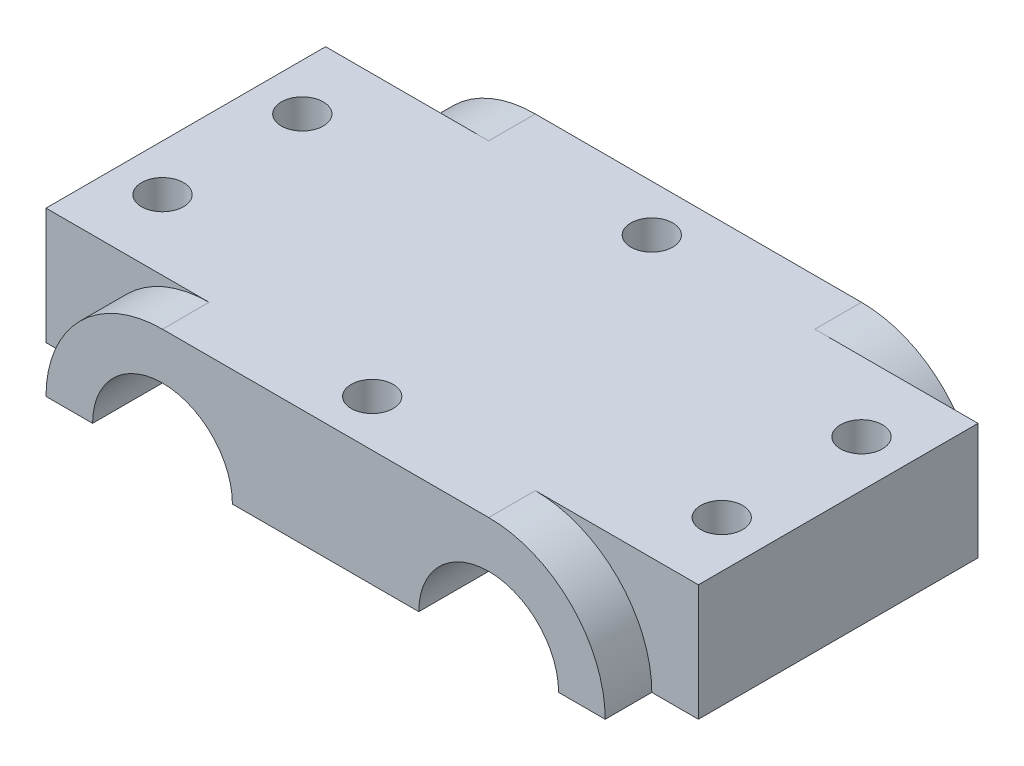
ISO-10303-21;
HEADER;
FILE_DESCRIPTION(('STEP AP214'),'2;1');
FILE_NAME('part.step','',(''),(''),'','','');
FILE_SCHEMA(('AUTOMOTIVE_DESIGN { 1 0 10303 214 1 1 1 1 }'));
ENDSEC;
DATA;
#1=APPLICATION_CONTEXT('core data for automotive mechanical design processes');
#2=APPLICATION_PROTOCOL_DEFINITION('international standard','automotive_design',2000,#1);
#3=PRODUCT_CONTEXT('',#1,'mechanical');
#4=PRODUCT('Part','Part','',(#3));
#5=PRODUCT_RELATED_PRODUCT_CATEGORY('part','',(#4));
#6=PRODUCT_DEFINITION_FORMATION('','',#4);
#7=PRODUCT_DEFINITION_CONTEXT('part definition',#1,'design');
#8=PRODUCT_DEFINITION('design','',#6,#7);
#9=PRODUCT_DEFINITION_SHAPE('','',#8);
#10=(LENGTH_UNIT() NAMED_UNIT(*) SI_UNIT(.MILLI.,.METRE.));
#11=(NAMED_UNIT(*) PLANE_ANGLE_UNIT() SI_UNIT($,.RADIAN.));
#12=(NAMED_UNIT(*) SI_UNIT($,.STERADIAN.) SOLID_ANGLE_UNIT());
#13=UNCERTAINTY_MEASURE_WITH_UNIT(LENGTH_MEASURE(1.E-05),#10,'distance_accuracy_value','');
#14=(GEOMETRIC_REPRESENTATION_CONTEXT(3) GLOBAL_UNCERTAINTY_ASSIGNED_CONTEXT((#13)) GLOBAL_UNIT_ASSIGNED_CONTEXT((#10,
#11,#12)) REPRESENTATION_CONTEXT('',''));
#15=CARTESIAN_POINT('',(0.,0.,0.));
#16=DIRECTION('',(0.,0.,1.));
#17=DIRECTION('',(1.,0.,0.));
#18=AXIS2_PLACEMENT_3D('',#15,#16,#17);
#19=CARTESIAN_POINT('',(0.,0.,0.));
#20=DIRECTION('',(0.,1.,0.));
#21=DIRECTION('',(0.,0.,1.));
#22=AXIS2_PLACEMENT_3D('',#19,#20,#21);
#23=PLANE('',#22);
#24=CARTESIAN_POINT('',(-30.,0.,7.49999999999999));
#25=DIRECTION('',(0.,1.,0.));
#26=DIRECTION('',(0.,0.,1.));
#27=AXIS2_PLACEMENT_3D('',#24,#25,#26);
#28=CIRCLE('',#27,2.25);
#29=CARTESIAN_POINT('',(-30.,0.,9.74999999999999));
#30=VERTEX_POINT('',#29);
#31=EDGE_CURVE('E584',#30,#30,#28,.T.);
#32=ORIENTED_EDGE('',*,*,#31,.T.);
#33=EDGE_LOOP('',(#32));
#34=FACE_BOUND('',#33,.T.);
#35=CARTESIAN_POINT('',(-30.,0.,-7.49999999999999));
#36=DIRECTION('',(0.,1.,0.));
#37=DIRECTION('',(0.,0.,-1.));
#38=AXIS2_PLACEMENT_3D('',#35,#36,#37);
#39=CIRCLE('',#38,2.25);
#40=CARTESIAN_POINT('',(-30.,0.,-9.74999999999999));
#41=VERTEX_POINT('',#40);
#42=EDGE_CURVE('E411',#41,#41,#39,.T.);
#43=ORIENTED_EDGE('',*,*,#42,.T.);
#44=EDGE_LOOP('',(#43));
#45=FACE_BOUND('',#44,.T.);
#46=DIRECTION('',(1.,0.,0.));
#47=VECTOR('',#46,1.);
#48=CARTESIAN_POINT('',(-30.,0.,-20.));
#49=LINE('',#48,#47);
#50=CARTESIAN_POINT('',(-30.,0.,-20.));
#51=VERTEX_POINT('',#50);
#52=CARTESIAN_POINT('',(-25.,0.,-20.));
#53=VERTEX_POINT('',#52);
#54=EDGE_CURVE('E230',#51,#53,#49,.T.);
#55=ORIENTED_EDGE('',*,*,#54,.T.);
#56=DIRECTION('',(0.,0.,1.));
#57=VECTOR('',#56,1.);
#58=CARTESIAN_POINT('',(-25.,0.,-20.));
#59=LINE('',#58,#57);
#60=CARTESIAN_POINT('',(-25.,0.,20.));
#61=VERTEX_POINT('',#60);
#62=EDGE_CURVE('E247',#53,#61,#59,.T.);
#63=ORIENTED_EDGE('',*,*,#62,.T.);
#64=DIRECTION('',(1.,0.,0.));
#65=VECTOR('',#64,1.);
#66=CARTESIAN_POINT('',(-30.,0.,20.));
#67=LINE('',#66,#65);
#68=CARTESIAN_POINT('',(-30.,0.,20.));
#69=VERTEX_POINT('',#68);
#70=EDGE_CURVE('E204',#69,#61,#67,.T.);
#71=ORIENTED_EDGE('',*,*,#70,.F.);
#72=DIRECTION('',(0.,0.,1.));
#73=VECTOR('',#72,1.);
#74=CARTESIAN_POINT('',(-30.,0.,-20.));
#75=LINE('',#74,#73);
#76=CARTESIAN_POINT('',(-30.,0.,15.));
#77=VERTEX_POINT('',#76);
#78=EDGE_CURVE('E254',#77,#69,#75,.T.);
#79=ORIENTED_EDGE('',*,*,#78,.F.);
#80=DIRECTION('',(1.,0.,0.));
#81=VECTOR('',#80,1.);
#82=CARTESIAN_POINT('',(35.,0.,15.));
#83=LINE('',#82,#81);
#84=CARTESIAN_POINT('',(-35.,0.,15.));
#85=VERTEX_POINT('',#84);
#86=EDGE_CURVE('E303',#85,#77,#83,.T.);
#87=ORIENTED_EDGE('',*,*,#86,.F.);
#88=DIRECTION('',(0.,0.,1.));
#89=VECTOR('',#88,1.);
#90=CARTESIAN_POINT('',(-35.,0.,15.));
#91=LINE('',#90,#89);
#92=CARTESIAN_POINT('',(-35.,0.,-15.));
#93=VERTEX_POINT('',#92);
#94=EDGE_CURVE('E281',#93,#85,#91,.T.);
#95=ORIENTED_EDGE('',*,*,#94,.F.);
#96=DIRECTION('',(-1.,0.,0.));
#97=VECTOR('',#96,1.);
#98=CARTESIAN_POINT('',(35.,0.,-15.));
#99=LINE('',#98,#97);
#100=CARTESIAN_POINT('',(-30.,0.,-15.));
#101=VERTEX_POINT('',#100);
#102=EDGE_CURVE('E309',#101,#93,#99,.T.);
#103=ORIENTED_EDGE('',*,*,#102,.F.);
#104=EDGE_CURVE('E250',#51,#101,#75,.T.);
#105=ORIENTED_EDGE('',*,*,#104,.F.);
#106=EDGE_LOOP('',(#55,#63,#71,#79,#87,#95,#103,#105));
#107=FACE_BOUND('',#106,.T.);
#108=ADVANCED_FACE('F39',(#34,#45,#107),#23,.F.);
#109=CARTESIAN_POINT('',(0.,0.,15.));
#110=DIRECTION('',(0.,1.,0.));
#111=DIRECTION('',(0.,0.,1.));
#112=AXIS2_PLACEMENT_3D('',#109,#110,#111);
#113=CIRCLE('',#112,2.25);
#114=CARTESIAN_POINT('',(0.,0.,17.25));
#115=VERTEX_POINT('',#114);
#116=EDGE_CURVE('E184',#115,#115,#113,.T.);
#117=ORIENTED_EDGE('',*,*,#116,.T.);
#118=EDGE_LOOP('',(#117));
#119=FACE_BOUND('',#118,.T.);
#120=CARTESIAN_POINT('',(0.,0.,-15.));
#121=DIRECTION('',(0.,1.,0.));
#122=DIRECTION('',(0.,0.,-1.));
#123=AXIS2_PLACEMENT_3D('',#120,#121,#122);
#124=CIRCLE('',#123,2.25);
#125=CARTESIAN_POINT('',(0.,0.,-17.25));
#126=VERTEX_POINT('',#125);
#127=EDGE_CURVE('E421',#126,#126,#124,.T.);
#128=ORIENTED_EDGE('',*,*,#127,.T.);
#129=EDGE_LOOP('',(#128));
#130=FACE_BOUND('',#129,.T.);
#131=DIRECTION('',(0.,0.,1.));
#132=VECTOR('',#131,1.);
#133=CARTESIAN_POINT('',(-10.,0.,-20.));
#134=LINE('',#133,#132);
#135=CARTESIAN_POINT('',(-10.,0.,-20.));
#136=VERTEX_POINT('',#135);
#137=CARTESIAN_POINT('',(-10.,0.,20.));
#138=VERTEX_POINT('',#137);
#139=EDGE_CURVE('E244',#136,#138,#134,.T.);
#140=ORIENTED_EDGE('',*,*,#139,.F.);
#141=DIRECTION('',(1.,0.,0.));
#142=VECTOR('',#141,1.);
#143=CARTESIAN_POINT('',(-10.,0.,-20.));
#144=LINE('',#143,#142);
#145=CARTESIAN_POINT('',(10.,0.,-20.));
#146=VERTEX_POINT('',#145);
#147=EDGE_CURVE('E166',#136,#146,#144,.T.);
#148=ORIENTED_EDGE('',*,*,#147,.T.);
#149=DIRECTION('',(0.,0.,1.));
#150=VECTOR('',#149,1.);
#151=CARTESIAN_POINT('',(10.,0.,-20.));
#152=LINE('',#151,#150);
#153=CARTESIAN_POINT('',(10.,0.,20.));
#154=VERTEX_POINT('',#153);
#155=EDGE_CURVE('E241',#146,#154,#152,.T.);
#156=ORIENTED_EDGE('',*,*,#155,.T.);
#157=DIRECTION('',(1.,0.,0.));
#158=VECTOR('',#157,1.);
#159=CARTESIAN_POINT('',(-10.,0.,20.));
#160=LINE('',#159,#158);
#161=EDGE_CURVE('E182',#138,#154,#160,.T.);
#162=ORIENTED_EDGE('',*,*,#161,.F.);
#163=EDGE_LOOP('',(#140,#148,#156,#162));
#164=FACE_BOUND('',#163,.T.);
#165=ADVANCED_FACE('F373',(#119,#130,#164),#23,.F.);
#166=CARTESIAN_POINT('',(35.,12.5,15.));
#167=DIRECTION('',(0.,0.,-1.));
#168=DIRECTION('',(-1.,0.,0.));
#169=AXIS2_PLACEMENT_3D('',#166,#167,#168);
#170=PLANE('',#169);
#171=ORIENTED_EDGE('',*,*,#86,.T.);
#172=CARTESIAN_POINT('',(-17.5,0.,15.));
#173=DIRECTION('',(0.,0.,-1.));
#174=DIRECTION('',(-1.,0.,0.));
#175=AXIS2_PLACEMENT_3D('',#172,#173,#174);
#176=CIRCLE('',#175,12.5);
#177=CARTESIAN_POINT('',(-17.5,12.5,15.));
#178=VERTEX_POINT('',#177);
#179=EDGE_CURVE('E278',#77,#178,#176,.T.);
#180=ORIENTED_EDGE('',*,*,#179,.T.);
#181=DIRECTION('',(1.,0.,0.));
#182=VECTOR('',#181,1.);
#183=CARTESIAN_POINT('',(35.,12.5,15.));
#184=LINE('',#183,#182);
#185=CARTESIAN_POINT('',(-35.,12.5,15.));
#186=VERTEX_POINT('',#185);
#187=EDGE_CURVE('E288',#186,#178,#184,.T.);
#188=ORIENTED_EDGE('',*,*,#187,.F.);
#189=DIRECTION('',(0.,-1.,0.));
#190=VECTOR('',#189,1.);
#191=CARTESIAN_POINT('',(-35.,12.5,15.));
#192=LINE('',#191,#190);
#193=EDGE_CURVE('E11',#186,#85,#192,.T.);
#194=ORIENTED_EDGE('',*,*,#193,.T.);
#195=EDGE_LOOP('',(#171,#180,#188,#194));
#196=FACE_BOUND('',#195,.T.);
#197=ADVANCED_FACE('F350',(#196),#170,.F.);
#198=CARTESIAN_POINT('',(35.,12.5,-15.));
#199=DIRECTION('',(0.,0.,1.));
#200=DIRECTION('',(1.,0.,0.));
#201=AXIS2_PLACEMENT_3D('',#198,#199,#200);
#202=PLANE('',#201);
#203=DIRECTION('',(-1.,0.,0.));
#204=VECTOR('',#203,1.);
#205=CARTESIAN_POINT('',(35.,12.5,-15.));
#206=LINE('',#205,#204);
#207=CARTESIAN_POINT('',(-17.5,12.5,-15.));
#208=VERTEX_POINT('',#207);
#209=CARTESIAN_POINT('',(-35.,12.5,-15.));
#210=VERTEX_POINT('',#209);
#211=EDGE_CURVE('E55',#208,#210,#206,.T.);
#212=ORIENTED_EDGE('',*,*,#211,.F.);
#213=CARTESIAN_POINT('',(-17.5,0.,-15.));
#214=DIRECTION('',(0.,0.,1.));
#215=DIRECTION('',(1.,0.,0.));
#216=AXIS2_PLACEMENT_3D('',#213,#214,#215);
#217=CIRCLE('',#216,12.5);
#218=EDGE_CURVE('E275',#208,#101,#217,.T.);
#219=ORIENTED_EDGE('',*,*,#218,.T.);
#220=ORIENTED_EDGE('',*,*,#102,.T.);
#221=DIRECTION('',(0.,-1.,0.));
#222=VECTOR('',#221,1.);
#223=CARTESIAN_POINT('',(-35.,12.5,-15.));
#224=LINE('',#223,#222);
#225=EDGE_CURVE('E298',#210,#93,#224,.T.);
#226=ORIENTED_EDGE('',*,*,#225,.F.);
#227=EDGE_LOOP('',(#212,#219,#220,#226));
#228=FACE_BOUND('',#227,.T.);
#229=ADVANCED_FACE('F345',(#228),#202,.F.);
#230=CARTESIAN_POINT('',(-35.,12.5,15.));
#231=DIRECTION('',(1.,0.,0.));
#232=DIRECTION('',(0.,0.,-1.));
#233=AXIS2_PLACEMENT_3D('',#230,#231,#232);
#234=PLANE('',#233);
#235=ORIENTED_EDGE('',*,*,#94,.T.);
#236=ORIENTED_EDGE('',*,*,#193,.F.);
#237=DIRECTION('',(0.,0.,1.));
#238=VECTOR('',#237,1.);
#239=CARTESIAN_POINT('',(-35.,12.5,15.));
#240=LINE('',#239,#238);
#241=EDGE_CURVE('E282',#210,#186,#240,.T.);
#242=ORIENTED_EDGE('',*,*,#241,.F.);
#243=ORIENTED_EDGE('',*,*,#225,.T.);
#244=EDGE_LOOP('',(#235,#236,#242,#243));
#245=FACE_BOUND('',#244,.T.);
#246=ADVANCED_FACE('F41',(#245),#234,.F.);
#247=CARTESIAN_POINT('',(17.5,12.5,15.));
#248=VERTEX_POINT('',#247);
#249=CARTESIAN_POINT('',(35.,12.5,15.));
#250=VERTEX_POINT('',#249);
#251=EDGE_CURVE('E286',#248,#250,#184,.T.);
#252=ORIENTED_EDGE('',*,*,#251,.F.);
#253=CARTESIAN_POINT('',(17.5,0.,15.));
#254=DIRECTION('',(0.,0.,-1.));
#255=DIRECTION('',(-1.,0.,0.));
#256=AXIS2_PLACEMENT_3D('',#253,#254,#255);
#257=CIRCLE('',#256,12.5);
#258=CARTESIAN_POINT('',(30.,0.,15.));
#259=VERTEX_POINT('',#258);
#260=EDGE_CURVE('E271',#248,#259,#257,.T.);
#261=ORIENTED_EDGE('',*,*,#260,.T.);
#262=CARTESIAN_POINT('',(35.,0.,15.));
#263=VERTEX_POINT('',#262);
#264=EDGE_CURVE('E302',#259,#263,#83,.T.);
#265=ORIENTED_EDGE('',*,*,#264,.T.);
#266=DIRECTION('',(0.,-1.,0.));
#267=VECTOR('',#266,1.);
#268=CARTESIAN_POINT('',(35.,12.5,15.));
#269=LINE('',#268,#267);
#270=EDGE_CURVE('E48',#250,#263,#269,.T.);
#271=ORIENTED_EDGE('',*,*,#270,.F.);
#272=EDGE_LOOP('',(#252,#261,#265,#271));
#273=FACE_BOUND('',#272,.T.);
#274=ADVANCED_FACE('F381',(#273),#170,.F.);
#275=CARTESIAN_POINT('',(35.,12.5,15.));
#276=DIRECTION('',(-1.,0.,0.));
#277=DIRECTION('',(0.,0.,1.));
#278=AXIS2_PLACEMENT_3D('',#275,#276,#277);
#279=PLANE('',#278);
#280=DIRECTION('',(0.,0.,-1.));
#281=VECTOR('',#280,1.);
#282=CARTESIAN_POINT('',(35.,0.,15.));
#283=LINE('',#282,#281);
#284=CARTESIAN_POINT('',(35.,0.,-15.));
#285=VERTEX_POINT('',#284);
#286=EDGE_CURVE('E306',#263,#285,#283,.T.);
#287=ORIENTED_EDGE('',*,*,#286,.T.);
#288=DIRECTION('',(0.,-1.,0.));
#289=VECTOR('',#288,1.);
#290=CARTESIAN_POINT('',(35.,12.5,-15.));
#291=LINE('',#290,#289);
#292=CARTESIAN_POINT('',(35.,12.5,-15.));
#293=VERTEX_POINT('',#292);
#294=EDGE_CURVE('E315',#293,#285,#291,.T.);
#295=ORIENTED_EDGE('',*,*,#294,.F.);
#296=DIRECTION('',(0.,0.,-1.));
#297=VECTOR('',#296,1.);
#298=CARTESIAN_POINT('',(35.,12.5,15.));
#299=LINE('',#298,#297);
#300=EDGE_CURVE('E292',#250,#293,#299,.T.);
#301=ORIENTED_EDGE('',*,*,#300,.F.);
#302=ORIENTED_EDGE('',*,*,#270,.T.);
#303=EDGE_LOOP('',(#287,#295,#301,#302));
#304=FACE_BOUND('',#303,.T.);
#305=ADVANCED_FACE('F324',(#304),#279,.F.);
#306=CARTESIAN_POINT('',(30.,0.,-15.));
#307=VERTEX_POINT('',#306);
#308=EDGE_CURVE('E287',#285,#307,#99,.T.);
#309=ORIENTED_EDGE('',*,*,#308,.T.);
#310=CARTESIAN_POINT('',(17.5,0.,-15.));
#311=DIRECTION('',(0.,0.,1.));
#312=DIRECTION('',(1.,0.,0.));
#313=AXIS2_PLACEMENT_3D('',#310,#311,#312);
#314=CIRCLE('',#313,12.5);
#315=CARTESIAN_POINT('',(17.5,12.5,-15.));
#316=VERTEX_POINT('',#315);
#317=EDGE_CURVE('E63',#307,#316,#314,.T.);
#318=ORIENTED_EDGE('',*,*,#317,.T.);
#319=EDGE_CURVE('E295',#293,#316,#206,.T.);
#320=ORIENTED_EDGE('',*,*,#319,.F.);
#321=ORIENTED_EDGE('',*,*,#294,.T.);
#322=EDGE_LOOP('',(#309,#318,#320,#321));
#323=FACE_BOUND('',#322,.T.);
#324=ADVANCED_FACE('F328',(#323),#202,.F.);
#325=CARTESIAN_POINT('',(0.,12.5,0.));
#326=DIRECTION('',(0.,1.,0.));
#327=DIRECTION('',(0.,0.,1.));
#328=AXIS2_PLACEMENT_3D('',#325,#326,#327);
#329=PLANE('',#328);
#330=CARTESIAN_POINT('',(0.,12.5,15.));
#331=DIRECTION('',(0.,1.,0.));
#332=DIRECTION('',(0.,0.,1.));
#333=AXIS2_PLACEMENT_3D('',#330,#331,#332);
#334=CIRCLE('',#333,2.25);
#335=CARTESIAN_POINT('',(0.,12.5,17.25));
#336=VERTEX_POINT('',#335);
#337=EDGE_CURVE('E188',#336,#336,#334,.T.);
#338=ORIENTED_EDGE('',*,*,#337,.F.);
#339=EDGE_LOOP('',(#338));
#340=FACE_BOUND('',#339,.T.);
#341=CARTESIAN_POINT('',(-30.,12.5,7.49999999999999));
#342=DIRECTION('',(0.,1.,0.));
#343=DIRECTION('',(0.,0.,1.));
#344=AXIS2_PLACEMENT_3D('',#341,#342,#343);
#345=CIRCLE('',#344,2.25);
#346=CARTESIAN_POINT('',(-30.,12.5,9.74999999999999));
#347=VERTEX_POINT('',#346);
#348=EDGE_CURVE('E588',#347,#347,#345,.T.);
#349=ORIENTED_EDGE('',*,*,#348,.F.);
#350=EDGE_LOOP('',(#349));
#351=FACE_BOUND('',#350,.T.);
#352=CARTESIAN_POINT('',(30.,12.5,7.49999999999997));
#353=DIRECTION('',(0.,1.,0.));
#354=DIRECTION('',(0.,0.,-1.));
#355=AXIS2_PLACEMENT_3D('',#352,#353,#354);
#356=CIRCLE('',#355,2.25);
#357=CARTESIAN_POINT('',(30.,12.5,5.24999999999998));
#358=VERTEX_POINT('',#357);
#359=EDGE_CURVE('E403',#358,#358,#356,.T.);
#360=ORIENTED_EDGE('',*,*,#359,.F.);
#361=EDGE_LOOP('',(#360));
#362=FACE_BOUND('',#361,.T.);
#363=CARTESIAN_POINT('',(30.,12.5,-7.49999999999997));
#364=DIRECTION('',(0.,1.,0.));
#365=DIRECTION('',(0.,0.,1.));
#366=AXIS2_PLACEMENT_3D('',#363,#364,#365);
#367=CIRCLE('',#366,2.25);
#368=CARTESIAN_POINT('',(30.,12.5,-5.24999999999998));
#369=VERTEX_POINT('',#368);
#370=EDGE_CURVE('E404',#369,#369,#367,.T.);
#371=ORIENTED_EDGE('',*,*,#370,.F.);
#372=EDGE_LOOP('',(#371));
#373=FACE_BOUND('',#372,.T.);
#374=CARTESIAN_POINT('',(-30.,12.5,-7.49999999999999));
#375=DIRECTION('',(0.,1.,0.));
#376=DIRECTION('',(0.,0.,-1.));
#377=AXIS2_PLACEMENT_3D('',#374,#375,#376);
#378=CIRCLE('',#377,2.25);
#379=CARTESIAN_POINT('',(-30.,12.5,-9.74999999999999));
#380=VERTEX_POINT('',#379);
#381=EDGE_CURVE('E418',#380,#380,#378,.T.);
#382=ORIENTED_EDGE('',*,*,#381,.F.);
#383=EDGE_LOOP('',(#382));
#384=FACE_BOUND('',#383,.T.);
#385=CARTESIAN_POINT('',(0.,12.5,-15.));
#386=DIRECTION('',(0.,1.,0.));
#387=DIRECTION('',(0.,0.,-1.));
#388=AXIS2_PLACEMENT_3D('',#385,#386,#387);
#389=CIRCLE('',#388,2.25);
#390=CARTESIAN_POINT('',(0.,12.5,-17.25));
#391=VERTEX_POINT('',#390);
#392=EDGE_CURVE('E191',#391,#391,#389,.T.);
#393=ORIENTED_EDGE('',*,*,#392,.F.);
#394=EDGE_LOOP('',(#393));
#395=FACE_BOUND('',#394,.T.);
#396=ORIENTED_EDGE('',*,*,#187,.T.);
#397=DIRECTION('',(0.,0.,1.));
#398=VECTOR('',#397,1.);
#399=CARTESIAN_POINT('',(-17.5,12.5,-20.));
#400=LINE('',#399,#398);
#401=CARTESIAN_POINT('',(-17.5,12.5,20.));
#402=VERTEX_POINT('',#401);
#403=EDGE_CURVE('E259',#178,#402,#400,.T.);
#404=ORIENTED_EDGE('',*,*,#403,.T.);
#405=DIRECTION('',(-1.,0.,0.));
#406=VECTOR('',#405,1.);
#407=CARTESIAN_POINT('',(17.5,12.5,20.));
#408=LINE('',#407,#406);
#409=CARTESIAN_POINT('',(17.5,12.5,20.));
#410=VERTEX_POINT('',#409);
#411=EDGE_CURVE('E196',#410,#402,#408,.T.);
#412=ORIENTED_EDGE('',*,*,#411,.F.);
#413=DIRECTION('',(0.,0.,1.));
#414=VECTOR('',#413,1.);
#415=CARTESIAN_POINT('',(17.5,12.5,-20.));
#416=LINE('',#415,#414);
#417=EDGE_CURVE('E264',#248,#410,#416,.T.);
#418=ORIENTED_EDGE('',*,*,#417,.F.);
#419=ORIENTED_EDGE('',*,*,#251,.T.);
#420=ORIENTED_EDGE('',*,*,#300,.T.);
#421=ORIENTED_EDGE('',*,*,#319,.T.);
#422=CARTESIAN_POINT('',(17.5,12.5,-20.));
#423=VERTEX_POINT('',#422);
#424=EDGE_CURVE('E260',#423,#316,#416,.T.);
#425=ORIENTED_EDGE('',*,*,#424,.F.);
#426=DIRECTION('',(-1.,0.,0.));
#427=VECTOR('',#426,1.);
#428=CARTESIAN_POINT('',(17.5,12.5,-20.));
#429=LINE('',#428,#427);
#430=CARTESIAN_POINT('',(-17.5,12.5,-20.));
#431=VERTEX_POINT('',#430);
#432=EDGE_CURVE('E222',#423,#431,#429,.T.);
#433=ORIENTED_EDGE('',*,*,#432,.T.);
#434=EDGE_CURVE('E255',#431,#208,#400,.T.);
#435=ORIENTED_EDGE('',*,*,#434,.T.);
#436=ORIENTED_EDGE('',*,*,#211,.T.);
#437=ORIENTED_EDGE('',*,*,#241,.T.);
#438=EDGE_LOOP('',(#396,#404,#412,#418,#419,#420,#421,#425,#433,#435,#436,#437));
#439=FACE_BOUND('',#438,.T.);
#440=ADVANCED_FACE('F334',(#340,#351,#362,#373,#384,#395,#439),#329,.T.);
#441=CARTESIAN_POINT('',(30.,0.,7.49999999999997));
#442=DIRECTION('',(0.,1.,0.));
#443=DIRECTION('',(0.,0.,-1.));
#444=AXIS2_PLACEMENT_3D('',#441,#442,#443);
#445=CIRCLE('',#444,2.25);
#446=CARTESIAN_POINT('',(30.,0.,5.24999999999998));
#447=VERTEX_POINT('',#446);
#448=EDGE_CURVE('E397',#447,#447,#445,.T.);
#449=ORIENTED_EDGE('',*,*,#448,.T.);
#450=EDGE_LOOP('',(#449));
#451=FACE_BOUND('',#450,.T.);
#452=CARTESIAN_POINT('',(30.,0.,-7.49999999999997));
#453=DIRECTION('',(0.,1.,0.));
#454=DIRECTION('',(0.,0.,1.));
#455=AXIS2_PLACEMENT_3D('',#452,#453,#454);
#456=CIRCLE('',#455,2.25);
#457=CARTESIAN_POINT('',(30.,0.,-5.24999999999998));
#458=VERTEX_POINT('',#457);
#459=EDGE_CURVE('E400',#458,#458,#456,.T.);
#460=ORIENTED_EDGE('',*,*,#459,.T.);
#461=EDGE_LOOP('',(#460));
#462=FACE_BOUND('',#461,.T.);
#463=DIRECTION('',(0.,0.,1.));
#464=VECTOR('',#463,1.);
#465=CARTESIAN_POINT('',(25.,0.,-20.));
#466=LINE('',#465,#464);
#467=CARTESIAN_POINT('',(25.,0.,-20.));
#468=VERTEX_POINT('',#467);
#469=CARTESIAN_POINT('',(25.,0.,20.));
#470=VERTEX_POINT('',#469);
#471=EDGE_CURVE('E154',#468,#470,#466,.T.);
#472=ORIENTED_EDGE('',*,*,#471,.F.);
#473=DIRECTION('',(1.,0.,0.));
#474=VECTOR('',#473,1.);
#475=CARTESIAN_POINT('',(30.,0.,-20.));
#476=LINE('',#475,#474);
#477=CARTESIAN_POINT('',(30.,0.,-20.));
#478=VERTEX_POINT('',#477);
#479=EDGE_CURVE('E215',#468,#478,#476,.T.);
#480=ORIENTED_EDGE('',*,*,#479,.T.);
#481=DIRECTION('',(0.,0.,1.));
#482=VECTOR('',#481,1.);
#483=CARTESIAN_POINT('',(30.,0.,-20.));
#484=LINE('',#483,#482);
#485=EDGE_CURVE('E265',#478,#307,#484,.T.);
#486=ORIENTED_EDGE('',*,*,#485,.T.);
#487=ORIENTED_EDGE('',*,*,#308,.F.);
#488=ORIENTED_EDGE('',*,*,#286,.F.);
#489=ORIENTED_EDGE('',*,*,#264,.F.);
#490=CARTESIAN_POINT('',(30.,0.,20.));
#491=VERTEX_POINT('',#490);
#492=EDGE_CURVE('E165',#259,#491,#484,.T.);
#493=ORIENTED_EDGE('',*,*,#492,.T.);
#494=DIRECTION('',(1.,0.,0.));
#495=VECTOR('',#494,1.);
#496=CARTESIAN_POINT('',(30.,0.,20.));
#497=LINE('',#496,#495);
#498=EDGE_CURVE('E169',#470,#491,#497,.T.);
#499=ORIENTED_EDGE('',*,*,#498,.F.);
#500=EDGE_LOOP('',(#472,#480,#486,#487,#488,#489,#493,#499));
#501=FACE_BOUND('',#500,.T.);
#502=ADVANCED_FACE('F170',(#451,#462,#501),#23,.F.);
#503=CARTESIAN_POINT('',(17.5,0.,-20.));
#504=DIRECTION('',(0.,0.,-1.));
#505=DIRECTION('',(-1.,0.,0.));
#506=AXIS2_PLACEMENT_3D('',#503,#504,#505);
#507=PLANE('',#506);
#508=CARTESIAN_POINT('',(17.5,0.,-20.));
#509=DIRECTION('',(0.,0.,-1.));
#510=DIRECTION('',(-1.,0.,0.));
#511=AXIS2_PLACEMENT_3D('',#508,#509,#510);
#512=CIRCLE('',#511,7.5);
#513=EDGE_CURVE('E160',#146,#468,#512,.T.);
#514=ORIENTED_EDGE('',*,*,#513,.F.);
#515=ORIENTED_EDGE('',*,*,#147,.F.);
#516=CARTESIAN_POINT('',(-17.5,0.,-20.));
#517=DIRECTION('',(0.,0.,-1.));
#518=DIRECTION('',(1.,0.,0.));
#519=AXIS2_PLACEMENT_3D('',#516,#517,#518);
#520=CIRCLE('',#519,7.5);
#521=EDGE_CURVE('E234',#53,#136,#520,.T.);
#522=ORIENTED_EDGE('',*,*,#521,.F.);
#523=ORIENTED_EDGE('',*,*,#54,.F.);
#524=CARTESIAN_POINT('',(-17.5,0.,-20.));
#525=DIRECTION('',(0.,0.,1.));
#526=DIRECTION('',(1.,0.,0.));
#527=AXIS2_PLACEMENT_3D('',#524,#525,#526);
#528=CIRCLE('',#527,12.5);
#529=EDGE_CURVE('E226',#431,#51,#528,.T.);
#530=ORIENTED_EDGE('',*,*,#529,.F.);
#531=ORIENTED_EDGE('',*,*,#432,.F.);
#532=CARTESIAN_POINT('',(17.5,0.,-20.));
#533=DIRECTION('',(0.,0.,1.));
#534=DIRECTION('',(-1.,0.,0.));
#535=AXIS2_PLACEMENT_3D('',#532,#533,#534);
#536=CIRCLE('',#535,12.5);
#537=EDGE_CURVE('E218',#478,#423,#536,.T.);
#538=ORIENTED_EDGE('',*,*,#537,.F.);
#539=ORIENTED_EDGE('',*,*,#479,.F.);
#540=EDGE_LOOP('',(#514,#515,#522,#523,#530,#531,#538,#539));
#541=FACE_BOUND('',#540,.T.);
#542=ADVANCED_FACE('F337',(#541),#507,.T.);
#543=CARTESIAN_POINT('',(17.5,0.,-20.));
#544=DIRECTION('',(0.,0.,1.));
#545=DIRECTION('',(1.,0.,0.));
#546=AXIS2_PLACEMENT_3D('',#543,#544,#545);
#547=CYLINDRICAL_SURFACE('',#546,12.5);
#548=ORIENTED_EDGE('',*,*,#317,.F.);
#549=ORIENTED_EDGE('',*,*,#485,.F.);
#550=ORIENTED_EDGE('',*,*,#537,.T.);
#551=ORIENTED_EDGE('',*,*,#424,.T.);
#552=EDGE_LOOP('',(#548,#549,#550,#551));
#553=FACE_BOUND('',#552,.T.);
#554=ADVANCED_FACE('F330',(#553),#547,.T.);
#555=CARTESIAN_POINT('',(-17.5,0.,-20.));
#556=DIRECTION('',(0.,0.,1.));
#557=DIRECTION('',(1.,0.,0.));
#558=AXIS2_PLACEMENT_3D('',#555,#556,#557);
#559=CYLINDRICAL_SURFACE('',#558,12.5);
#560=ORIENTED_EDGE('',*,*,#218,.F.);
#561=ORIENTED_EDGE('',*,*,#434,.F.);
#562=ORIENTED_EDGE('',*,*,#529,.T.);
#563=ORIENTED_EDGE('',*,*,#104,.T.);
#564=EDGE_LOOP('',(#560,#561,#562,#563));
#565=FACE_BOUND('',#564,.T.);
#566=ADVANCED_FACE('F341',(#565),#559,.T.);
#567=CARTESIAN_POINT('',(17.5,0.,-20.));
#568=DIRECTION('',(0.,0.,1.));
#569=DIRECTION('',(1.,0.,0.));
#570=AXIS2_PLACEMENT_3D('',#567,#568,#569);
#571=CYLINDRICAL_SURFACE('',#570,7.5);
#572=ORIENTED_EDGE('',*,*,#155,.F.);
#573=ORIENTED_EDGE('',*,*,#513,.T.);
#574=ORIENTED_EDGE('',*,*,#471,.T.);
#575=CARTESIAN_POINT('',(17.5,0.,20.));
#576=DIRECTION('',(0.,0.,-1.));
#577=DIRECTION('',(-1.,0.,0.));
#578=AXIS2_PLACEMENT_3D('',#575,#576,#577);
#579=CIRCLE('',#578,7.5);
#580=EDGE_CURVE('E158',#154,#470,#579,.T.);
#581=ORIENTED_EDGE('',*,*,#580,.F.);
#582=EDGE_LOOP('',(#572,#573,#574,#581));
#583=FACE_BOUND('',#582,.T.);
#584=ADVANCED_FACE('F156',(#583),#571,.F.);
#585=CARTESIAN_POINT('',(-17.5,0.,-20.));
#586=DIRECTION('',(0.,0.,1.));
#587=DIRECTION('',(1.,0.,0.));
#588=AXIS2_PLACEMENT_3D('',#585,#586,#587);
#589=CYLINDRICAL_SURFACE('',#588,7.5);
#590=ORIENTED_EDGE('',*,*,#62,.F.);
#591=ORIENTED_EDGE('',*,*,#521,.T.);
#592=ORIENTED_EDGE('',*,*,#139,.T.);
#593=CARTESIAN_POINT('',(-17.5,0.,20.));
#594=DIRECTION('',(0.,0.,-1.));
#595=DIRECTION('',(1.,0.,0.));
#596=AXIS2_PLACEMENT_3D('',#593,#594,#595);
#597=CIRCLE('',#596,7.5);
#598=EDGE_CURVE('E208',#61,#138,#597,.T.);
#599=ORIENTED_EDGE('',*,*,#598,.F.);
#600=EDGE_LOOP('',(#590,#591,#592,#599));
#601=FACE_BOUND('',#600,.T.);
#602=ADVANCED_FACE('F370',(#601),#589,.F.);
#603=ORIENTED_EDGE('',*,*,#179,.F.);
#604=ORIENTED_EDGE('',*,*,#78,.T.);
#605=CARTESIAN_POINT('',(-17.5,0.,20.));
#606=DIRECTION('',(0.,0.,1.));
#607=DIRECTION('',(1.,0.,0.));
#608=AXIS2_PLACEMENT_3D('',#605,#606,#607);
#609=CIRCLE('',#608,12.5);
#610=EDGE_CURVE('E200',#402,#69,#609,.T.);
#611=ORIENTED_EDGE('',*,*,#610,.F.);
#612=ORIENTED_EDGE('',*,*,#403,.F.);
#613=EDGE_LOOP('',(#603,#604,#611,#612));
#614=FACE_BOUND('',#613,.T.);
#615=ADVANCED_FACE('F356',(#614),#559,.T.);
#616=ORIENTED_EDGE('',*,*,#260,.F.);
#617=ORIENTED_EDGE('',*,*,#417,.T.);
#618=CARTESIAN_POINT('',(17.5,0.,20.));
#619=DIRECTION('',(0.,0.,1.));
#620=DIRECTION('',(-1.,0.,0.));
#621=AXIS2_PLACEMENT_3D('',#618,#619,#620);
#622=CIRCLE('',#621,12.5);
#623=EDGE_CURVE('E176',#491,#410,#622,.T.);
#624=ORIENTED_EDGE('',*,*,#623,.F.);
#625=ORIENTED_EDGE('',*,*,#492,.F.);
#626=EDGE_LOOP('',(#616,#617,#624,#625));
#627=FACE_BOUND('',#626,.T.);
#628=ADVANCED_FACE('F365',(#627),#547,.T.);
#629=CARTESIAN_POINT('',(17.5,0.,20.));
#630=DIRECTION('',(0.,0.,-1.));
#631=DIRECTION('',(-1.,0.,0.));
#632=AXIS2_PLACEMENT_3D('',#629,#630,#631);
#633=PLANE('',#632);
#634=ORIENTED_EDGE('',*,*,#580,.T.);
#635=ORIENTED_EDGE('',*,*,#498,.T.);
#636=ORIENTED_EDGE('',*,*,#623,.T.);
#637=ORIENTED_EDGE('',*,*,#411,.T.);
#638=ORIENTED_EDGE('',*,*,#610,.T.);
#639=ORIENTED_EDGE('',*,*,#70,.T.);
#640=ORIENTED_EDGE('',*,*,#598,.T.);
#641=ORIENTED_EDGE('',*,*,#161,.T.);
#642=EDGE_LOOP('',(#634,#635,#636,#637,#638,#639,#640,#641));
#643=FACE_BOUND('',#642,.T.);
#644=ADVANCED_FACE('F179',(#643),#633,.F.);
#645=CARTESIAN_POINT('',(30.,0.,-7.49999999999997));
#646=DIRECTION('',(0.,1.,0.));
#647=DIRECTION('',(0.,0.,1.));
#648=AXIS2_PLACEMENT_3D('',#645,#646,#647);
#649=CYLINDRICAL_SURFACE('',#648,2.25);
#650=ORIENTED_EDGE('',*,*,#459,.F.);
#651=EDGE_LOOP('',(#650));
#652=FACE_BOUND('',#651,.T.);
#653=ORIENTED_EDGE('',*,*,#370,.T.);
#654=EDGE_LOOP('',(#653));
#655=FACE_BOUND('',#654,.T.);
#656=ADVANCED_FACE('F443',(#652,#655),#649,.F.);
#657=CARTESIAN_POINT('',(30.,0.,7.49999999999997));
#658=DIRECTION('',(0.,1.,0.));
#659=DIRECTION('',(0.,0.,1.));
#660=AXIS2_PLACEMENT_3D('',#657,#658,#659);
#661=CYLINDRICAL_SURFACE('',#660,2.25);
#662=ORIENTED_EDGE('',*,*,#448,.F.);
#663=EDGE_LOOP('',(#662));
#664=FACE_BOUND('',#663,.T.);
#665=ORIENTED_EDGE('',*,*,#359,.T.);
#666=EDGE_LOOP('',(#665));
#667=FACE_BOUND('',#666,.T.);
#668=ADVANCED_FACE('F433',(#664,#667),#661,.F.);
#669=CARTESIAN_POINT('',(0.,0.,-15.));
#670=DIRECTION('',(0.,1.,0.));
#671=DIRECTION('',(0.,0.,1.));
#672=AXIS2_PLACEMENT_3D('',#669,#670,#671);
#673=CYLINDRICAL_SURFACE('',#672,2.25);
#674=ORIENTED_EDGE('',*,*,#127,.F.);
#675=EDGE_LOOP('',(#674));
#676=FACE_BOUND('',#675,.T.);
#677=ORIENTED_EDGE('',*,*,#392,.T.);
#678=EDGE_LOOP('',(#677));
#679=FACE_BOUND('',#678,.T.);
#680=ADVANCED_FACE('F429',(#676,#679),#673,.F.);
#681=CARTESIAN_POINT('',(-30.,0.,-7.49999999999999));
#682=DIRECTION('',(0.,1.,0.));
#683=DIRECTION('',(0.,0.,1.));
#684=AXIS2_PLACEMENT_3D('',#681,#682,#683);
#685=CYLINDRICAL_SURFACE('',#684,2.25);
#686=ORIENTED_EDGE('',*,*,#42,.F.);
#687=EDGE_LOOP('',(#686));
#688=FACE_BOUND('',#687,.T.);
#689=ORIENTED_EDGE('',*,*,#381,.T.);
#690=EDGE_LOOP('',(#689));
#691=FACE_BOUND('',#690,.T.);
#692=ADVANCED_FACE('F432',(#688,#691),#685,.F.);
#693=CARTESIAN_POINT('',(-30.,0.,7.49999999999999));
#694=DIRECTION('',(0.,1.,0.));
#695=DIRECTION('',(0.,0.,1.));
#696=AXIS2_PLACEMENT_3D('',#693,#694,#695);
#697=CYLINDRICAL_SURFACE('',#696,2.25);
#698=ORIENTED_EDGE('',*,*,#31,.F.);
#699=EDGE_LOOP('',(#698));
#700=FACE_BOUND('',#699,.T.);
#701=ORIENTED_EDGE('',*,*,#348,.T.);
#702=EDGE_LOOP('',(#701));
#703=FACE_BOUND('',#702,.T.);
#704=ADVANCED_FACE('F440',(#700,#703),#697,.F.);
#705=CARTESIAN_POINT('',(0.,0.,15.));
#706=DIRECTION('',(0.,1.,0.));
#707=DIRECTION('',(0.,0.,1.));
#708=AXIS2_PLACEMENT_3D('',#705,#706,#707);
#709=CYLINDRICAL_SURFACE('',#708,2.25);
#710=ORIENTED_EDGE('',*,*,#116,.F.);
#711=EDGE_LOOP('',(#710));
#712=FACE_BOUND('',#711,.T.);
#713=ORIENTED_EDGE('',*,*,#337,.T.);
#714=EDGE_LOOP('',(#713));
#715=FACE_BOUND('',#714,.T.);
#716=ADVANCED_FACE('F565',(#712,#715),#709,.F.);
#717=CLOSED_SHELL('',(#108,#165,#197,#229,#246,#274,#305,#324,#440,#502,#542,#554,#566,#584,
#602,#615,#628,#644,#656,#668,#680,#692,#704,#716));
#718=MANIFOLD_SOLID_BREP('B2',#717);
#719=ADVANCED_BREP_SHAPE_REPRESENTATION('',(#18,#718),#14);
#720=SHAPE_DEFINITION_REPRESENTATION(#9,#719);
ENDSEC;
END-ISO-10303-21;
